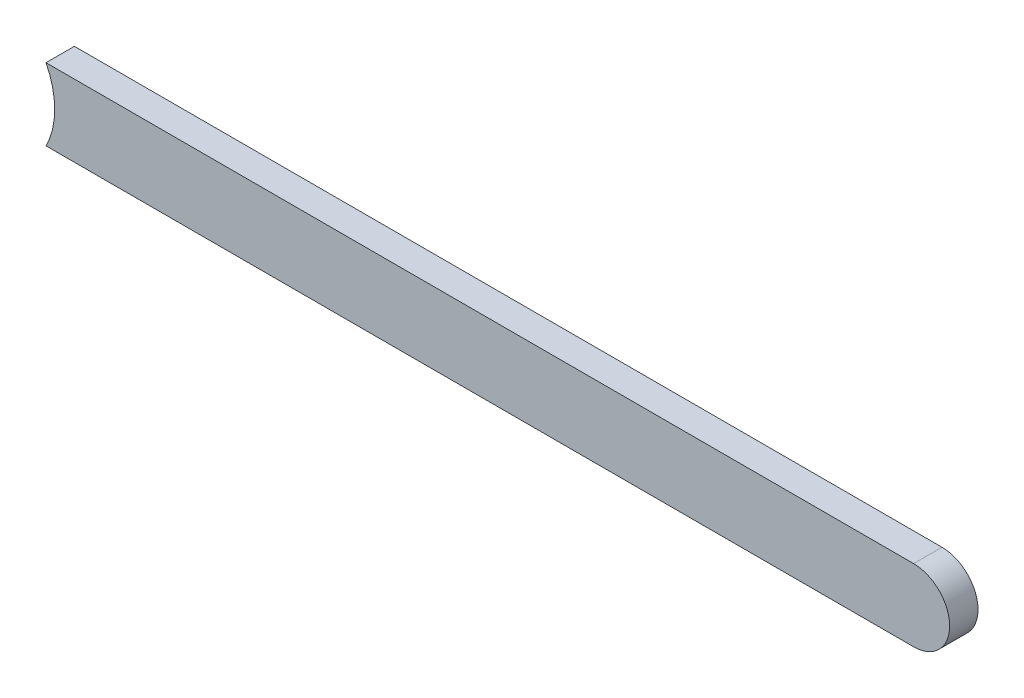
ISO-10303-21;
HEADER;
FILE_DESCRIPTION(('STEP AP214'),'2;1');
FILE_NAME('part.step','',(''),(''),'','','');
FILE_SCHEMA(('AUTOMOTIVE_DESIGN { 1 0 10303 214 1 1 1 1 }'));
ENDSEC;
DATA;
#1=APPLICATION_CONTEXT('core data for automotive mechanical design processes');
#2=APPLICATION_PROTOCOL_DEFINITION('international standard','automotive_design',2000,#1);
#3=PRODUCT_CONTEXT('',#1,'mechanical');
#4=PRODUCT('Part','Part','',(#3));
#5=PRODUCT_RELATED_PRODUCT_CATEGORY('part','',(#4));
#6=PRODUCT_DEFINITION_FORMATION('','',#4);
#7=PRODUCT_DEFINITION_CONTEXT('part definition',#1,'design');
#8=PRODUCT_DEFINITION('design','',#6,#7);
#9=PRODUCT_DEFINITION_SHAPE('','',#8);
#10=(LENGTH_UNIT() NAMED_UNIT(*) SI_UNIT(.MILLI.,.METRE.));
#11=(NAMED_UNIT(*) PLANE_ANGLE_UNIT() SI_UNIT($,.RADIAN.));
#12=(NAMED_UNIT(*) SI_UNIT($,.STERADIAN.) SOLID_ANGLE_UNIT());
#13=UNCERTAINTY_MEASURE_WITH_UNIT(LENGTH_MEASURE(1.E-05),#10,'distance_accuracy_value','');
#14=(GEOMETRIC_REPRESENTATION_CONTEXT(3) GLOBAL_UNCERTAINTY_ASSIGNED_CONTEXT((#13)) GLOBAL_UNIT_ASSIGNED_CONTEXT((#10,
#11,#12)) REPRESENTATION_CONTEXT('',''));
#15=CARTESIAN_POINT('',(0.,0.,0.));
#16=DIRECTION('',(0.,0.,1.));
#17=DIRECTION('',(1.,0.,0.));
#18=AXIS2_PLACEMENT_3D('',#15,#16,#17);
#19=CARTESIAN_POINT('',(129.518202090858,106.045,0.));
#20=DIRECTION('',(0.,1.,0.));
#21=DIRECTION('',(1.,0.,0.));
#22=AXIS2_PLACEMENT_3D('',#19,#20,#21);
#23=PLANE('',#22);
#24=DIRECTION('',(1.,0.,0.));
#25=VECTOR('',#24,1.);
#26=CARTESIAN_POINT('',(129.0247356,106.045,0.1999996));
#27=LINE('',#26,#25);
#28=CARTESIAN_POINT('',(129.518202090858,106.045,0.1999996));
#29=VERTEX_POINT('',#28);
#30=CARTESIAN_POINT('',(135.636,106.045,0.1999996));
#31=VERTEX_POINT('',#30);
#32=EDGE_CURVE('E11',#29,#31,#27,.T.);
#33=ORIENTED_EDGE('',*,*,#32,.F.);
#34=DIRECTION('',(0.,0.,1.));
#35=VECTOR('',#34,1.);
#36=CARTESIAN_POINT('',(129.518202090858,106.045,0.));
#37=LINE('',#36,#35);
#38=CARTESIAN_POINT('',(129.518202090858,106.045,0.));
#39=VERTEX_POINT('',#38);
#40=EDGE_CURVE('E24',#39,#29,#37,.T.);
#41=ORIENTED_EDGE('',*,*,#40,.F.);
#42=DIRECTION('',(1.,0.,0.));
#43=VECTOR('',#42,1.);
#44=CARTESIAN_POINT('',(129.0247356,106.045,0.));
#45=LINE('',#44,#43);
#46=CARTESIAN_POINT('',(135.636,106.045,0.));
#47=VERTEX_POINT('',#46);
#48=EDGE_CURVE('E82',#39,#47,#45,.T.);
#49=ORIENTED_EDGE('',*,*,#48,.T.);
#50=DIRECTION('',(0.,0.,1.));
#51=VECTOR('',#50,1.);
#52=CARTESIAN_POINT('',(135.636,106.045,0.));
#53=LINE('',#52,#51);
#54=EDGE_CURVE('E37',#47,#31,#53,.T.);
#55=ORIENTED_EDGE('',*,*,#54,.T.);
#56=EDGE_LOOP('',(#33,#41,#49,#55));
#57=FACE_BOUND('',#56,.T.);
#58=ADVANCED_FACE('F17',(#57),#23,.F.);
#59=CARTESIAN_POINT('',(135.636,106.299,0.));
#60=DIRECTION('',(0.,0.,-1.));
#61=DIRECTION('',(1.11896493820492E-13,-1.,0.));
#62=AXIS2_PLACEMENT_3D('',#59,#60,#61);
#63=CYLINDRICAL_SURFACE('',#62,0.254000000000005);
#64=CARTESIAN_POINT('',(135.636,106.299,0.1999996));
#65=DIRECTION('',(0.,0.,1.));
#66=DIRECTION('',(1.11896493820492E-13,-1.,0.));
#67=AXIS2_PLACEMENT_3D('',#64,#65,#66);
#68=CIRCLE('',#67,0.254000000000005);
#69=CARTESIAN_POINT('',(135.636,106.553,0.1999996));
#70=VERTEX_POINT('',#69);
#71=EDGE_CURVE('E97',#31,#70,#68,.T.);
#72=ORIENTED_EDGE('',*,*,#71,.F.);
#73=ORIENTED_EDGE('',*,*,#54,.F.);
#74=CARTESIAN_POINT('',(135.636,106.299,0.));
#75=DIRECTION('',(0.,0.,1.));
#76=DIRECTION('',(1.11896493820492E-13,-1.,0.));
#77=AXIS2_PLACEMENT_3D('',#74,#75,#76);
#78=CIRCLE('',#77,0.254000000000005);
#79=CARTESIAN_POINT('',(135.636,106.553,0.));
#80=VERTEX_POINT('',#79);
#81=EDGE_CURVE('E94',#47,#80,#78,.T.);
#82=ORIENTED_EDGE('',*,*,#81,.T.);
#83=DIRECTION('',(0.,0.,1.));
#84=VECTOR('',#83,1.);
#85=CARTESIAN_POINT('',(135.636,106.553,0.));
#86=LINE('',#85,#84);
#87=EDGE_CURVE('E92',#80,#70,#86,.T.);
#88=ORIENTED_EDGE('',*,*,#87,.T.);
#89=EDGE_LOOP('',(#72,#73,#82,#88));
#90=FACE_BOUND('',#89,.T.);
#91=ADVANCED_FACE('F103',(#90),#63,.T.);
#92=CARTESIAN_POINT('',(135.636,106.553,0.));
#93=DIRECTION('',(0.,-1.,0.));
#94=DIRECTION('',(-1.,0.,0.));
#95=AXIS2_PLACEMENT_3D('',#92,#93,#94);
#96=PLANE('',#95);
#97=DIRECTION('',(-1.,0.,0.));
#98=VECTOR('',#97,1.);
#99=CARTESIAN_POINT('',(135.636,106.553,0.1999996));
#100=LINE('',#99,#98);
#101=CARTESIAN_POINT('',(129.518202090858,106.553,0.1999996));
#102=VERTEX_POINT('',#101);
#103=EDGE_CURVE('E89',#70,#102,#100,.T.);
#104=ORIENTED_EDGE('',*,*,#103,.F.);
#105=ORIENTED_EDGE('',*,*,#87,.F.);
#106=DIRECTION('',(-1.,0.,0.));
#107=VECTOR('',#106,1.);
#108=CARTESIAN_POINT('',(135.636,106.553,0.));
#109=LINE('',#108,#107);
#110=CARTESIAN_POINT('',(129.518202090858,106.553,0.));
#111=VERTEX_POINT('',#110);
#112=EDGE_CURVE('E87',#80,#111,#109,.T.);
#113=ORIENTED_EDGE('',*,*,#112,.T.);
#114=DIRECTION('',(0.,0.,1.));
#115=VECTOR('',#114,1.);
#116=CARTESIAN_POINT('',(129.518202090858,106.553,0.));
#117=LINE('',#116,#115);
#118=EDGE_CURVE('E69',#111,#102,#117,.T.);
#119=ORIENTED_EDGE('',*,*,#118,.T.);
#120=EDGE_LOOP('',(#104,#105,#113,#119));
#121=FACE_BOUND('',#120,.T.);
#122=ADVANCED_FACE('F108',(#121),#96,.F.);
#123=CARTESIAN_POINT('',(129.0247356,106.299,0.));
#124=DIRECTION('',(0.,0.,-1.));
#125=DIRECTION('',(1.,0.,0.));
#126=AXIS2_PLACEMENT_3D('',#123,#124,#125);
#127=CYLINDRICAL_SURFACE('',#126,0.55500016);
#128=DIRECTION('',(0.,0.,1.));
#129=VECTOR('',#128,1.);
#130=CARTESIAN_POINT('',(129.57973576,106.299,0.));
#131=LINE('',#130,#129);
#132=CARTESIAN_POINT('',(129.57973576,106.299,0.));
#133=VERTEX_POINT('',#132);
#134=CARTESIAN_POINT('',(129.57973576,106.299,0.1999996));
#135=VERTEX_POINT('',#134);
#136=EDGE_CURVE('E59',#133,#135,#131,.T.);
#137=ORIENTED_EDGE('',*,*,#136,.T.);
#138=CARTESIAN_POINT('',(129.0247356,106.299,0.1999996));
#139=DIRECTION('',(0.,0.,1.));
#140=DIRECTION('',(1.,0.,0.));
#141=AXIS2_PLACEMENT_3D('',#138,#139,#140);
#142=CIRCLE('',#141,0.55500016);
#143=EDGE_CURVE('E70',#135,#102,#142,.T.);
#144=ORIENTED_EDGE('',*,*,#143,.T.);
#145=ORIENTED_EDGE('',*,*,#118,.F.);
#146=CARTESIAN_POINT('',(129.0247356,106.299,0.));
#147=DIRECTION('',(0.,0.,1.));
#148=DIRECTION('',(1.,0.,0.));
#149=AXIS2_PLACEMENT_3D('',#146,#147,#148);
#150=CIRCLE('',#149,0.55500016);
#151=EDGE_CURVE('E73',#133,#111,#150,.T.);
#152=ORIENTED_EDGE('',*,*,#151,.F.);
#153=EDGE_LOOP('',(#137,#144,#145,#152));
#154=FACE_BOUND('',#153,.T.);
#155=ADVANCED_FACE('F74',(#154),#127,.F.);
#156=CARTESIAN_POINT('',(129.0247356,106.299,0.));
#157=DIRECTION('',(0.,0.,-1.));
#158=DIRECTION('',(1.,0.,0.));
#159=AXIS2_PLACEMENT_3D('',#156,#157,#158);
#160=CYLINDRICAL_SURFACE('',#159,0.55500016);
#161=ORIENTED_EDGE('',*,*,#40,.T.);
#162=CARTESIAN_POINT('',(129.0247356,106.299,0.1999996));
#163=DIRECTION('',(0.,0.,1.));
#164=DIRECTION('',(1.,0.,0.));
#165=AXIS2_PLACEMENT_3D('',#162,#163,#164);
#166=CIRCLE('',#165,0.55500016);
#167=EDGE_CURVE('E65',#29,#135,#166,.T.);
#168=ORIENTED_EDGE('',*,*,#167,.T.);
#169=ORIENTED_EDGE('',*,*,#136,.F.);
#170=EDGE_CURVE('E63',#39,#133,#150,.T.);
#171=ORIENTED_EDGE('',*,*,#170,.F.);
#172=EDGE_LOOP('',(#161,#168,#169,#171));
#173=FACE_BOUND('',#172,.T.);
#174=ADVANCED_FACE('F61',(#173),#160,.F.);
#175=CARTESIAN_POINT('',(129.0247356,106.045,0.));
#176=DIRECTION('',(0.,0.,-1.));
#177=DIRECTION('',(-1.,0.,0.));
#178=AXIS2_PLACEMENT_3D('',#175,#176,#177);
#179=PLANE('',#178);
#180=ORIENTED_EDGE('',*,*,#48,.F.);
#181=ORIENTED_EDGE('',*,*,#170,.T.);
#182=ORIENTED_EDGE('',*,*,#151,.T.);
#183=ORIENTED_EDGE('',*,*,#112,.F.);
#184=ORIENTED_EDGE('',*,*,#81,.F.);
#185=EDGE_LOOP('',(#180,#181,#182,#183,#184));
#186=FACE_BOUND('',#185,.T.);
#187=ADVANCED_FACE('F80',(#186),#179,.T.);
#188=CARTESIAN_POINT('',(129.0247356,106.045,0.1999996));
#189=DIRECTION('',(0.,0.,-1.));
#190=DIRECTION('',(-1.,0.,0.));
#191=AXIS2_PLACEMENT_3D('',#188,#189,#190);
#192=PLANE('',#191);
#193=ORIENTED_EDGE('',*,*,#167,.F.);
#194=ORIENTED_EDGE('',*,*,#32,.T.);
#195=ORIENTED_EDGE('',*,*,#71,.T.);
#196=ORIENTED_EDGE('',*,*,#103,.T.);
#197=ORIENTED_EDGE('',*,*,#143,.F.);
#198=EDGE_LOOP('',(#193,#194,#195,#196,#197));
#199=FACE_BOUND('',#198,.T.);
#200=ADVANCED_FACE('F106',(#199),#192,.F.);
#201=CLOSED_SHELL('',(#58,#91,#122,#155,#174,#187,#200));
#202=MANIFOLD_SOLID_BREP('B1',#201);
#203=ADVANCED_BREP_SHAPE_REPRESENTATION('',(#18,#202),#14);
#204=SHAPE_DEFINITION_REPRESENTATION(#9,#203);
ENDSEC;
END-ISO-10303-21;
